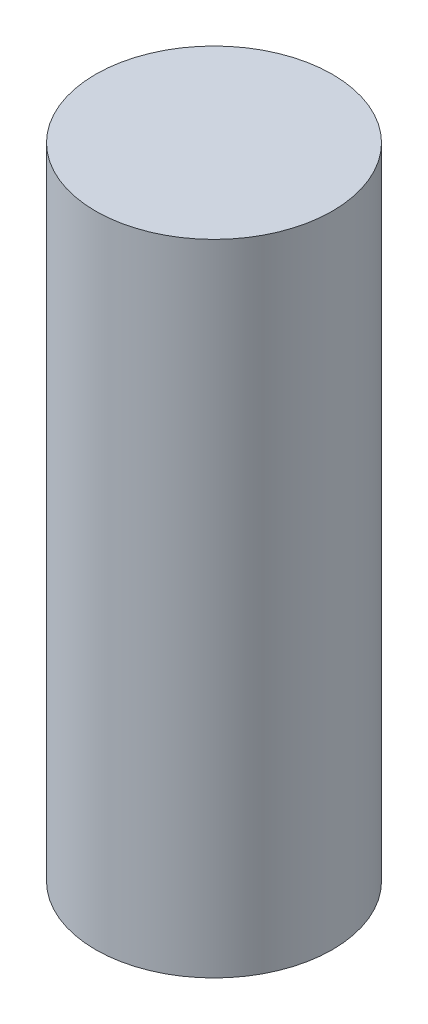
ISO-10303-21;
HEADER;
FILE_DESCRIPTION(('STEP AP214'),'2;1');
FILE_NAME('part.step','',(''),(''),'','','');
FILE_SCHEMA(('AUTOMOTIVE_DESIGN { 1 0 10303 214 1 1 1 1 }'));
ENDSEC;
DATA;
#1=APPLICATION_CONTEXT('core data for automotive mechanical design processes');
#2=APPLICATION_PROTOCOL_DEFINITION('international standard','automotive_design',2000,#1);
#3=PRODUCT_CONTEXT('',#1,'mechanical');
#4=PRODUCT('Part','Part','',(#3));
#5=PRODUCT_RELATED_PRODUCT_CATEGORY('part','',(#4));
#6=PRODUCT_DEFINITION_FORMATION('','',#4);
#7=PRODUCT_DEFINITION_CONTEXT('part definition',#1,'design');
#8=PRODUCT_DEFINITION('design','',#6,#7);
#9=PRODUCT_DEFINITION_SHAPE('','',#8);
#10=(LENGTH_UNIT() NAMED_UNIT(*) SI_UNIT(.MILLI.,.METRE.));
#11=(NAMED_UNIT(*) PLANE_ANGLE_UNIT() SI_UNIT($,.RADIAN.));
#12=(NAMED_UNIT(*) SI_UNIT($,.STERADIAN.) SOLID_ANGLE_UNIT());
#13=UNCERTAINTY_MEASURE_WITH_UNIT(LENGTH_MEASURE(1.E-05),#10,'distance_accuracy_value','');
#14=(GEOMETRIC_REPRESENTATION_CONTEXT(3) GLOBAL_UNCERTAINTY_ASSIGNED_CONTEXT((#13)) GLOBAL_UNIT_ASSIGNED_CONTEXT((#10,
#11,#12)) REPRESENTATION_CONTEXT('',''));
#15=CARTESIAN_POINT('',(0.,0.,0.));
#16=DIRECTION('',(0.,0.,1.));
#17=DIRECTION('',(1.,0.,0.));
#18=AXIS2_PLACEMENT_3D('',#15,#16,#17);
#19=CARTESIAN_POINT('',(66.407188736207,54.,51.1463892900679));
#20=DIRECTION('',(0.,-1.,0.));
#21=DIRECTION('',(0.,0.,-1.));
#22=AXIS2_PLACEMENT_3D('',#19,#20,#21);
#23=CYLINDRICAL_SURFACE('',#22,9.99999999999999);
#24=CARTESIAN_POINT('',(66.407188736207,54.,51.1463892900679));
#25=DIRECTION('',(0.,1.,0.));
#26=DIRECTION('',(0.,0.,1.));
#27=AXIS2_PLACEMENT_3D('',#24,#25,#26);
#28=CIRCLE('',#27,9.99999999999999);
#29=CARTESIAN_POINT('',(66.407188736207,54.,61.1463892900679));
#30=VERTEX_POINT('',#29);
#31=EDGE_CURVE('E10',#30,#30,#28,.T.);
#32=ORIENTED_EDGE('',*,*,#31,.F.);
#33=EDGE_LOOP('',(#32));
#34=FACE_BOUND('',#33,.T.);
#35=CARTESIAN_POINT('',(66.407188736207,0.,51.1463892900679));
#36=DIRECTION('',(0.,1.,0.));
#37=DIRECTION('',(0.,0.,1.));
#38=AXIS2_PLACEMENT_3D('',#35,#36,#37);
#39=CIRCLE('',#38,9.99999999999999);
#40=CARTESIAN_POINT('',(66.407188736207,0.,61.1463892900679));
#41=VERTEX_POINT('',#40);
#42=EDGE_CURVE('E36',#41,#41,#39,.T.);
#43=ORIENTED_EDGE('',*,*,#42,.T.);
#44=EDGE_LOOP('',(#43));
#45=FACE_BOUND('',#44,.T.);
#46=ADVANCED_FACE('F33',(#34,#45),#23,.T.);
#47=CARTESIAN_POINT('',(66.407188736207,54.,51.1463892900679));
#48=DIRECTION('',(0.,1.,0.));
#49=DIRECTION('',(0.,0.,1.));
#50=AXIS2_PLACEMENT_3D('',#47,#48,#49);
#51=PLANE('',#50);
#52=ORIENTED_EDGE('',*,*,#31,.T.);
#53=EDGE_LOOP('',(#52));
#54=FACE_BOUND('',#53,.T.);
#55=ADVANCED_FACE('F48',(#54),#51,.T.);
#56=CARTESIAN_POINT('',(66.407188736207,0.,51.1463892900679));
#57=DIRECTION('',(0.,1.,0.));
#58=DIRECTION('',(0.,0.,1.));
#59=AXIS2_PLACEMENT_3D('',#56,#57,#58);
#60=PLANE('',#59);
#61=ORIENTED_EDGE('',*,*,#42,.F.);
#62=EDGE_LOOP('',(#61));
#63=FACE_BOUND('',#62,.T.);
#64=ADVANCED_FACE('F46',(#63),#60,.F.);
#65=CLOSED_SHELL('',(#46,#55,#64));
#66=MANIFOLD_SOLID_BREP('B2',#65);
#67=ADVANCED_BREP_SHAPE_REPRESENTATION('',(#18,#66),#14);
#68=SHAPE_DEFINITION_REPRESENTATION(#9,#67);
ENDSEC;
END-ISO-10303-21;
